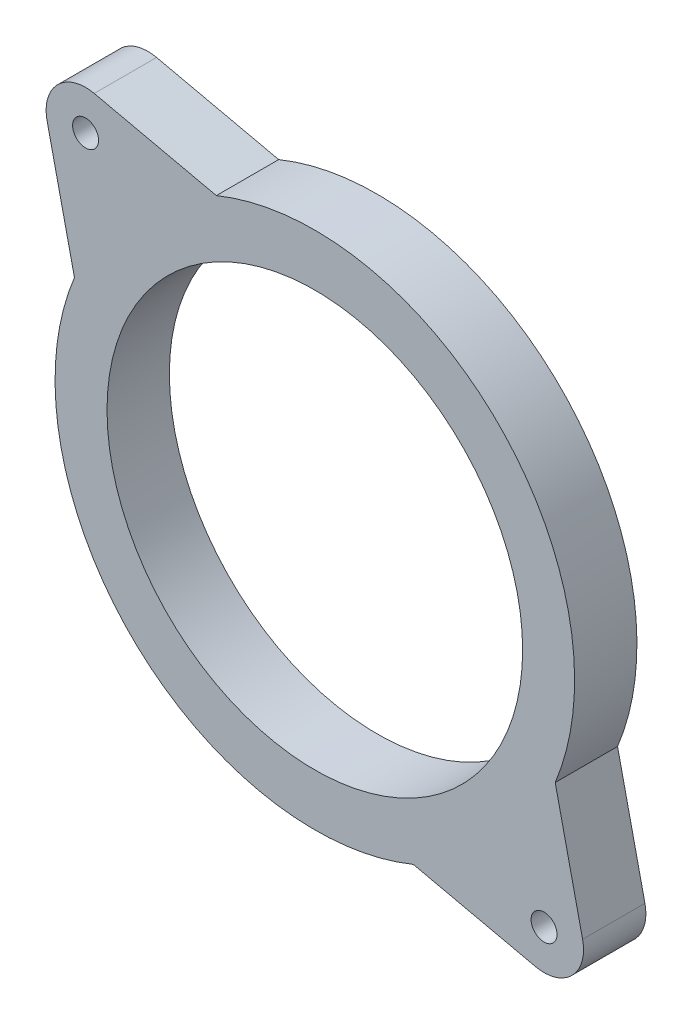
ISO-10303-21;
HEADER;
FILE_DESCRIPTION(('STEP AP214'),'2;1');
FILE_NAME('part.step','',(''),(''),'','','');
FILE_SCHEMA(('AUTOMOTIVE_DESIGN { 1 0 10303 214 1 1 1 1 }'));
ENDSEC;
DATA;
#1=APPLICATION_CONTEXT('core data for automotive mechanical design processes');
#2=APPLICATION_PROTOCOL_DEFINITION('international standard','automotive_design',2000,#1);
#3=PRODUCT_CONTEXT('',#1,'mechanical');
#4=PRODUCT('Part','Part','',(#3));
#5=PRODUCT_RELATED_PRODUCT_CATEGORY('part','',(#4));
#6=PRODUCT_DEFINITION_FORMATION('','',#4);
#7=PRODUCT_DEFINITION_CONTEXT('part definition',#1,'design');
#8=PRODUCT_DEFINITION('design','',#6,#7);
#9=PRODUCT_DEFINITION_SHAPE('','',#8);
#10=(LENGTH_UNIT() NAMED_UNIT(*) SI_UNIT(.MILLI.,.METRE.));
#11=(NAMED_UNIT(*) PLANE_ANGLE_UNIT() SI_UNIT($,.RADIAN.));
#12=(NAMED_UNIT(*) SI_UNIT($,.STERADIAN.) SOLID_ANGLE_UNIT());
#13=UNCERTAINTY_MEASURE_WITH_UNIT(LENGTH_MEASURE(1.E-05),#10,'distance_accuracy_value','');
#14=(GEOMETRIC_REPRESENTATION_CONTEXT(3) GLOBAL_UNCERTAINTY_ASSIGNED_CONTEXT((#13)) GLOBAL_UNIT_ASSIGNED_CONTEXT((#10,
#11,#12)) REPRESENTATION_CONTEXT('',''));
#15=CARTESIAN_POINT('',(0.,0.,0.));
#16=DIRECTION('',(0.,0.,1.));
#17=DIRECTION('',(1.,0.,0.));
#18=AXIS2_PLACEMENT_3D('',#15,#16,#17);
#19=CARTESIAN_POINT('',(0.,0.,6.));
#20=DIRECTION('',(0.,0.,1.));
#21=DIRECTION('',(1.,0.,0.));
#22=AXIS2_PLACEMENT_3D('',#19,#20,#21);
#23=PLANE('',#22);
#24=CARTESIAN_POINT('',(-22.0617315730203,22.0617315730202,6.));
#25=DIRECTION('',(0.,0.,1.));
#26=DIRECTION('',(1.,0.,0.));
#27=AXIS2_PLACEMENT_3D('',#24,#25,#26);
#28=CIRCLE('',#27,1.24999999999999);
#29=CARTESIAN_POINT('',(-20.8117315730203,22.0617315730202,6.));
#30=VERTEX_POINT('',#29);
#31=EDGE_CURVE('E196',#30,#30,#28,.T.);
#32=ORIENTED_EDGE('',*,*,#31,.F.);
#33=EDGE_LOOP('',(#32));
#34=FACE_BOUND('',#33,.T.);
#35=CARTESIAN_POINT('',(22.0617315730203,-22.0617315730202,6.));
#36=DIRECTION('',(0.,0.,1.));
#37=DIRECTION('',(1.,0.,0.));
#38=AXIS2_PLACEMENT_3D('',#35,#36,#37);
#39=CIRCLE('',#38,1.24999999999999);
#40=CARTESIAN_POINT('',(23.3117315730203,-22.0617315730202,6.));
#41=VERTEX_POINT('',#40);
#42=EDGE_CURVE('E190',#41,#41,#39,.T.);
#43=ORIENTED_EDGE('',*,*,#42,.F.);
#44=EDGE_LOOP('',(#43));
#45=FACE_BOUND('',#44,.T.);
#46=CARTESIAN_POINT('',(0.,0.,6.));
#47=DIRECTION('',(0.,0.,1.));
#48=DIRECTION('',(1.,0.,0.));
#49=AXIS2_PLACEMENT_3D('',#46,#47,#48);
#50=CIRCLE('',#49,25.);
#51=CARTESIAN_POINT('',(-23.1341304887046,9.47691967527358,6.));
#52=VERTEX_POINT('',#51);
#53=CARTESIAN_POINT('',(9.47691967527366,-23.1341304887046,6.));
#54=VERTEX_POINT('',#53);
#55=EDGE_CURVE('E148',#52,#54,#50,.T.);
#56=ORIENTED_EDGE('',*,*,#55,.T.);
#57=DIRECTION('',(0.975769204515665,-0.21880232978391,0.));
#58=VECTOR('',#57,1.);
#59=CARTESIAN_POINT('',(9.47691967527366,-23.1341304887046,6.));
#60=LINE('',#59,#58);
#61=CARTESIAN_POINT('',(21.2302827198415,-25.7696545501798,6.));
#62=VERTEX_POINT('',#61);
#63=EDGE_CURVE('E96',#54,#62,#60,.T.);
#64=ORIENTED_EDGE('',*,*,#63,.T.);
#65=CARTESIAN_POINT('',(22.0617315730203,-22.0617315730202,6.));
#66=DIRECTION('',(0.,0.,1.));
#67=DIRECTION('',(1.,0.,0.));
#68=AXIS2_PLACEMENT_3D('',#65,#66,#67);
#69=CIRCLE('',#68,3.80000000000001);
#70=CARTESIAN_POINT('',(25.7696545501799,-21.2302827198414,6.));
#71=VERTEX_POINT('',#70);
#72=EDGE_CURVE('E163',#62,#71,#69,.T.);
#73=ORIENTED_EDGE('',*,*,#72,.T.);
#74=DIRECTION('',(-0.218802329783913,0.975769204515664,0.));
#75=VECTOR('',#74,1.);
#76=CARTESIAN_POINT('',(25.7696545501799,-21.2302827198414,6.));
#77=LINE('',#76,#75);
#78=CARTESIAN_POINT('',(23.1341304887046,-9.47691967527358,6.));
#79=VERTEX_POINT('',#78);
#80=EDGE_CURVE('E176',#71,#79,#77,.T.);
#81=ORIENTED_EDGE('',*,*,#80,.T.);
#82=CARTESIAN_POINT('',(0.,0.,6.));
#83=DIRECTION('',(0.,0.,1.));
#84=DIRECTION('',(1.,0.,0.));
#85=AXIS2_PLACEMENT_3D('',#82,#83,#84);
#86=CIRCLE('',#85,25.);
#87=CARTESIAN_POINT('',(-9.47691967527366,23.1341304887046,6.));
#88=VERTEX_POINT('',#87);
#89=EDGE_CURVE('E115',#79,#88,#86,.T.);
#90=ORIENTED_EDGE('',*,*,#89,.T.);
#91=DIRECTION('',(-0.975769204515665,0.21880232978391,0.));
#92=VECTOR('',#91,1.);
#93=CARTESIAN_POINT('',(-9.47691967527366,23.1341304887046,6.));
#94=LINE('',#93,#92);
#95=CARTESIAN_POINT('',(-21.2302827198415,25.7696545501798,6.));
#96=VERTEX_POINT('',#95);
#97=EDGE_CURVE('E109',#88,#96,#94,.T.);
#98=ORIENTED_EDGE('',*,*,#97,.T.);
#99=CARTESIAN_POINT('',(-22.0617315730203,22.0617315730202,6.));
#100=DIRECTION('',(0.,0.,1.));
#101=DIRECTION('',(1.,0.,0.));
#102=AXIS2_PLACEMENT_3D('',#99,#100,#101);
#103=CIRCLE('',#102,3.80000000000001);
#104=CARTESIAN_POINT('',(-25.7696545501799,21.2302827198414,6.));
#105=VERTEX_POINT('',#104);
#106=EDGE_CURVE('E113',#96,#105,#103,.T.);
#107=ORIENTED_EDGE('',*,*,#106,.T.);
#108=DIRECTION('',(0.218802329783914,-0.975769204515664,0.));
#109=VECTOR('',#108,1.);
#110=CARTESIAN_POINT('',(-25.7696545501799,21.2302827198414,6.));
#111=LINE('',#110,#109);
#112=EDGE_CURVE('E53',#105,#52,#111,.T.);
#113=ORIENTED_EDGE('',*,*,#112,.T.);
#114=EDGE_LOOP('',(#56,#64,#73,#81,#90,#98,#107,#113));
#115=FACE_BOUND('',#114,.T.);
#116=CARTESIAN_POINT('',(0.,0.,6.));
#117=DIRECTION('',(0.,0.,1.));
#118=DIRECTION('',(1.,0.,0.));
#119=AXIS2_PLACEMENT_3D('',#116,#117,#118);
#120=CIRCLE('',#119,20.);
#121=CARTESIAN_POINT('',(20.,0.,6.));
#122=VERTEX_POINT('',#121);
#123=EDGE_CURVE('E137',#122,#122,#120,.T.);
#124=ORIENTED_EDGE('',*,*,#123,.F.);
#125=EDGE_LOOP('',(#124));
#126=FACE_BOUND('',#125,.T.);
#127=ADVANCED_FACE('F36',(#34,#45,#115,#126),#23,.T.);
#128=CARTESIAN_POINT('',(0.,0.,0.));
#129=DIRECTION('',(0.,0.,1.));
#130=DIRECTION('',(1.,0.,0.));
#131=AXIS2_PLACEMENT_3D('',#128,#129,#130);
#132=PLANE('',#131);
#133=CARTESIAN_POINT('',(-22.0617315730203,22.0617315730202,0.));
#134=DIRECTION('',(0.,0.,1.));
#135=DIRECTION('',(1.,0.,0.));
#136=AXIS2_PLACEMENT_3D('',#133,#134,#135);
#137=CIRCLE('',#136,1.25);
#138=CARTESIAN_POINT('',(-20.8117315730203,22.0617315730202,0.));
#139=VERTEX_POINT('',#138);
#140=EDGE_CURVE('E193',#139,#139,#137,.T.);
#141=ORIENTED_EDGE('',*,*,#140,.T.);
#142=EDGE_LOOP('',(#141));
#143=FACE_BOUND('',#142,.T.);
#144=CARTESIAN_POINT('',(22.0617315730203,-22.0617315730202,0.));
#145=DIRECTION('',(0.,0.,1.));
#146=DIRECTION('',(1.,0.,0.));
#147=AXIS2_PLACEMENT_3D('',#144,#145,#146);
#148=CIRCLE('',#147,1.25);
#149=CARTESIAN_POINT('',(23.3117315730203,-22.0617315730202,0.));
#150=VERTEX_POINT('',#149);
#151=EDGE_CURVE('E185',#150,#150,#148,.T.);
#152=ORIENTED_EDGE('',*,*,#151,.T.);
#153=EDGE_LOOP('',(#152));
#154=FACE_BOUND('',#153,.T.);
#155=CARTESIAN_POINT('',(0.,0.,0.));
#156=DIRECTION('',(0.,0.,1.));
#157=DIRECTION('',(1.,0.,0.));
#158=AXIS2_PLACEMENT_3D('',#155,#156,#157);
#159=CIRCLE('',#158,25.);
#160=CARTESIAN_POINT('',(-23.1341304887046,9.47691967527358,0.));
#161=VERTEX_POINT('',#160);
#162=CARTESIAN_POINT('',(9.47691967527366,-23.1341304887046,0.));
#163=VERTEX_POINT('',#162);
#164=EDGE_CURVE('E133',#161,#163,#159,.T.);
#165=ORIENTED_EDGE('',*,*,#164,.F.);
#166=DIRECTION('',(0.218802329783914,-0.975769204515664,0.));
#167=VECTOR('',#166,1.);
#168=CARTESIAN_POINT('',(-25.7696545501799,21.2302827198414,0.));
#169=LINE('',#168,#167);
#170=CARTESIAN_POINT('',(-25.7696545501799,21.2302827198414,0.));
#171=VERTEX_POINT('',#170);
#172=EDGE_CURVE('E88',#171,#161,#169,.T.);
#173=ORIENTED_EDGE('',*,*,#172,.F.);
#174=CARTESIAN_POINT('',(-22.0617315730203,22.0617315730202,0.));
#175=DIRECTION('',(0.,0.,1.));
#176=DIRECTION('',(1.,0.,0.));
#177=AXIS2_PLACEMENT_3D('',#174,#175,#176);
#178=CIRCLE('',#177,3.80000000000001);
#179=CARTESIAN_POINT('',(-21.2302827198415,25.7696545501798,0.));
#180=VERTEX_POINT('',#179);
#181=EDGE_CURVE('E82',#180,#171,#178,.T.);
#182=ORIENTED_EDGE('',*,*,#181,.F.);
#183=DIRECTION('',(-0.975769204515665,0.21880232978391,0.));
#184=VECTOR('',#183,1.);
#185=CARTESIAN_POINT('',(-9.47691967527366,23.1341304887046,0.));
#186=LINE('',#185,#184);
#187=CARTESIAN_POINT('',(-9.47691967527366,23.1341304887046,0.));
#188=VERTEX_POINT('',#187);
#189=EDGE_CURVE('E123',#188,#180,#186,.T.);
#190=ORIENTED_EDGE('',*,*,#189,.F.);
#191=CARTESIAN_POINT('',(0.,0.,0.));
#192=DIRECTION('',(0.,0.,1.));
#193=DIRECTION('',(1.,0.,0.));
#194=AXIS2_PLACEMENT_3D('',#191,#192,#193);
#195=CIRCLE('',#194,25.);
#196=CARTESIAN_POINT('',(23.1341304887046,-9.47691967527358,0.));
#197=VERTEX_POINT('',#196);
#198=EDGE_CURVE('E143',#197,#188,#195,.T.);
#199=ORIENTED_EDGE('',*,*,#198,.F.);
#200=DIRECTION('',(-0.218802329783913,0.975769204515664,0.));
#201=VECTOR('',#200,1.);
#202=CARTESIAN_POINT('',(25.7696545501799,-21.2302827198414,0.));
#203=LINE('',#202,#201);
#204=CARTESIAN_POINT('',(25.7696545501799,-21.2302827198414,0.));
#205=VERTEX_POINT('',#204);
#206=EDGE_CURVE('E141',#205,#197,#203,.T.);
#207=ORIENTED_EDGE('',*,*,#206,.F.);
#208=CARTESIAN_POINT('',(22.0617315730203,-22.0617315730202,0.));
#209=DIRECTION('',(0.,0.,1.));
#210=DIRECTION('',(1.,0.,0.));
#211=AXIS2_PLACEMENT_3D('',#208,#209,#210);
#212=CIRCLE('',#211,3.80000000000001);
#213=CARTESIAN_POINT('',(21.2302827198415,-25.7696545501798,0.));
#214=VERTEX_POINT('',#213);
#215=EDGE_CURVE('E139',#214,#205,#212,.T.);
#216=ORIENTED_EDGE('',*,*,#215,.F.);
#217=DIRECTION('',(0.975769204515665,-0.21880232978391,0.));
#218=VECTOR('',#217,1.);
#219=CARTESIAN_POINT('',(9.47691967527366,-23.1341304887046,0.));
#220=LINE('',#219,#218);
#221=EDGE_CURVE('E136',#163,#214,#220,.T.);
#222=ORIENTED_EDGE('',*,*,#221,.F.);
#223=EDGE_LOOP('',(#165,#173,#182,#190,#199,#207,#216,#222));
#224=FACE_BOUND('',#223,.T.);
#225=CARTESIAN_POINT('',(0.,0.,0.));
#226=DIRECTION('',(0.,0.,1.));
#227=DIRECTION('',(1.,0.,0.));
#228=AXIS2_PLACEMENT_3D('',#225,#226,#227);
#229=CIRCLE('',#228,20.);
#230=CARTESIAN_POINT('',(20.,0.,0.));
#231=VERTEX_POINT('',#230);
#232=EDGE_CURVE('E182',#231,#231,#229,.T.);
#233=ORIENTED_EDGE('',*,*,#232,.T.);
#234=EDGE_LOOP('',(#233));
#235=FACE_BOUND('',#234,.T.);
#236=ADVANCED_FACE('F167',(#143,#154,#224,#235),#132,.F.);
#237=CARTESIAN_POINT('',(0.,0.,6.));
#238=DIRECTION('',(0.,0.,-1.));
#239=DIRECTION('',(-1.,0.,0.));
#240=AXIS2_PLACEMENT_3D('',#237,#238,#239);
#241=CYLINDRICAL_SURFACE('',#240,25.);
#242=ORIENTED_EDGE('',*,*,#164,.T.);
#243=DIRECTION('',(0.,0.,-1.));
#244=VECTOR('',#243,1.);
#245=CARTESIAN_POINT('',(9.47691967527366,-23.1341304887046,6.));
#246=LINE('',#245,#244);
#247=EDGE_CURVE('E11',#54,#163,#246,.T.);
#248=ORIENTED_EDGE('',*,*,#247,.F.);
#249=ORIENTED_EDGE('',*,*,#55,.F.);
#250=DIRECTION('',(0.,0.,-1.));
#251=VECTOR('',#250,1.);
#252=CARTESIAN_POINT('',(-23.1341304887046,9.47691967527358,6.));
#253=LINE('',#252,#251);
#254=EDGE_CURVE('E129',#52,#161,#253,.T.);
#255=ORIENTED_EDGE('',*,*,#254,.T.);
#256=EDGE_LOOP('',(#242,#248,#249,#255));
#257=FACE_BOUND('',#256,.T.);
#258=ADVANCED_FACE('F38',(#257),#241,.T.);
#259=CARTESIAN_POINT('',(9.47691967527366,-23.1341304887046,6.));
#260=DIRECTION('',(0.21880232978391,0.975769204515665,0.));
#261=DIRECTION('',(-0.975769204515665,0.21880232978391,0.));
#262=AXIS2_PLACEMENT_3D('',#259,#260,#261);
#263=PLANE('',#262);
#264=ORIENTED_EDGE('',*,*,#221,.T.);
#265=DIRECTION('',(0.,0.,-1.));
#266=VECTOR('',#265,1.);
#267=CARTESIAN_POINT('',(21.2302827198415,-25.7696545501798,6.));
#268=LINE('',#267,#266);
#269=EDGE_CURVE('E45',#62,#214,#268,.T.);
#270=ORIENTED_EDGE('',*,*,#269,.F.);
#271=ORIENTED_EDGE('',*,*,#63,.F.);
#272=ORIENTED_EDGE('',*,*,#247,.T.);
#273=EDGE_LOOP('',(#264,#270,#271,#272));
#274=FACE_BOUND('',#273,.T.);
#275=ADVANCED_FACE('F237',(#274),#263,.F.);
#276=CARTESIAN_POINT('',(22.0617315730203,-22.0617315730202,6.));
#277=DIRECTION('',(0.,0.,-1.));
#278=DIRECTION('',(-1.,0.,0.));
#279=AXIS2_PLACEMENT_3D('',#276,#277,#278);
#280=CYLINDRICAL_SURFACE('',#279,3.80000000000001);
#281=ORIENTED_EDGE('',*,*,#215,.T.);
#282=DIRECTION('',(0.,0.,-1.));
#283=VECTOR('',#282,1.);
#284=CARTESIAN_POINT('',(25.7696545501799,-21.2302827198414,6.));
#285=LINE('',#284,#283);
#286=EDGE_CURVE('E155',#71,#205,#285,.T.);
#287=ORIENTED_EDGE('',*,*,#286,.F.);
#288=ORIENTED_EDGE('',*,*,#72,.F.);
#289=ORIENTED_EDGE('',*,*,#269,.T.);
#290=EDGE_LOOP('',(#281,#287,#288,#289));
#291=FACE_BOUND('',#290,.T.);
#292=ADVANCED_FACE('F161',(#291),#280,.T.);
#293=CARTESIAN_POINT('',(25.7696545501799,-21.2302827198414,6.));
#294=DIRECTION('',(-0.975769204515664,-0.218802329783913,0.));
#295=DIRECTION('',(0.218802329783913,-0.975769204515664,0.));
#296=AXIS2_PLACEMENT_3D('',#293,#294,#295);
#297=PLANE('',#296);
#298=ORIENTED_EDGE('',*,*,#206,.T.);
#299=DIRECTION('',(0.,0.,-1.));
#300=VECTOR('',#299,1.);
#301=CARTESIAN_POINT('',(23.1341304887046,-9.47691967527358,6.));
#302=LINE('',#301,#300);
#303=EDGE_CURVE('E152',#79,#197,#302,.T.);
#304=ORIENTED_EDGE('',*,*,#303,.F.);
#305=ORIENTED_EDGE('',*,*,#80,.F.);
#306=ORIENTED_EDGE('',*,*,#286,.T.);
#307=EDGE_LOOP('',(#298,#304,#305,#306));
#308=FACE_BOUND('',#307,.T.);
#309=ADVANCED_FACE('F172',(#308),#297,.F.);
#310=CARTESIAN_POINT('',(0.,0.,6.));
#311=DIRECTION('',(0.,0.,-1.));
#312=DIRECTION('',(-1.,0.,0.));
#313=AXIS2_PLACEMENT_3D('',#310,#311,#312);
#314=CYLINDRICAL_SURFACE('',#313,25.);
#315=ORIENTED_EDGE('',*,*,#198,.T.);
#316=DIRECTION('',(0.,0.,-1.));
#317=VECTOR('',#316,1.);
#318=CARTESIAN_POINT('',(-9.47691967527366,23.1341304887046,6.));
#319=LINE('',#318,#317);
#320=EDGE_CURVE('E124',#88,#188,#319,.T.);
#321=ORIENTED_EDGE('',*,*,#320,.F.);
#322=ORIENTED_EDGE('',*,*,#89,.F.);
#323=ORIENTED_EDGE('',*,*,#303,.T.);
#324=EDGE_LOOP('',(#315,#321,#322,#323));
#325=FACE_BOUND('',#324,.T.);
#326=ADVANCED_FACE('F175',(#325),#314,.T.);
#327=CARTESIAN_POINT('',(-9.47691967527366,23.1341304887046,6.));
#328=DIRECTION('',(-0.21880232978391,-0.975769204515665,0.));
#329=DIRECTION('',(0.975769204515665,-0.21880232978391,0.));
#330=AXIS2_PLACEMENT_3D('',#327,#328,#329);
#331=PLANE('',#330);
#332=ORIENTED_EDGE('',*,*,#189,.T.);
#333=DIRECTION('',(0.,0.,-1.));
#334=VECTOR('',#333,1.);
#335=CARTESIAN_POINT('',(-21.2302827198415,25.7696545501798,6.));
#336=LINE('',#335,#334);
#337=EDGE_CURVE('E120',#96,#180,#336,.T.);
#338=ORIENTED_EDGE('',*,*,#337,.F.);
#339=ORIENTED_EDGE('',*,*,#97,.F.);
#340=ORIENTED_EDGE('',*,*,#320,.T.);
#341=EDGE_LOOP('',(#332,#338,#339,#340));
#342=FACE_BOUND('',#341,.T.);
#343=ADVANCED_FACE('F121',(#342),#331,.F.);
#344=CARTESIAN_POINT('',(-22.0617315730203,22.0617315730202,6.));
#345=DIRECTION('',(0.,0.,-1.));
#346=DIRECTION('',(-1.,0.,0.));
#347=AXIS2_PLACEMENT_3D('',#344,#345,#346);
#348=CYLINDRICAL_SURFACE('',#347,3.80000000000001);
#349=ORIENTED_EDGE('',*,*,#181,.T.);
#350=DIRECTION('',(0.,0.,-1.));
#351=VECTOR('',#350,1.);
#352=CARTESIAN_POINT('',(-25.7696545501799,21.2302827198414,6.));
#353=LINE('',#352,#351);
#354=EDGE_CURVE('E125',#105,#171,#353,.T.);
#355=ORIENTED_EDGE('',*,*,#354,.F.);
#356=ORIENTED_EDGE('',*,*,#106,.F.);
#357=ORIENTED_EDGE('',*,*,#337,.T.);
#358=EDGE_LOOP('',(#349,#355,#356,#357));
#359=FACE_BOUND('',#358,.T.);
#360=ADVANCED_FACE('F127',(#359),#348,.T.);
#361=CARTESIAN_POINT('',(-25.7696545501799,21.2302827198414,6.));
#362=DIRECTION('',(0.975769204515664,0.218802329783914,0.));
#363=DIRECTION('',(-0.218802329783914,0.975769204515664,0.));
#364=AXIS2_PLACEMENT_3D('',#361,#362,#363);
#365=PLANE('',#364);
#366=ORIENTED_EDGE('',*,*,#172,.T.);
#367=ORIENTED_EDGE('',*,*,#254,.F.);
#368=ORIENTED_EDGE('',*,*,#112,.F.);
#369=ORIENTED_EDGE('',*,*,#354,.T.);
#370=EDGE_LOOP('',(#366,#367,#368,#369));
#371=FACE_BOUND('',#370,.T.);
#372=ADVANCED_FACE('F218',(#371),#365,.F.);
#373=CARTESIAN_POINT('',(0.,0.,6.));
#374=DIRECTION('',(0.,0.,-1.));
#375=DIRECTION('',(-1.,0.,0.));
#376=AXIS2_PLACEMENT_3D('',#373,#374,#375);
#377=CYLINDRICAL_SURFACE('',#376,20.);
#378=ORIENTED_EDGE('',*,*,#123,.T.);
#379=EDGE_LOOP('',(#378));
#380=FACE_BOUND('',#379,.T.);
#381=ORIENTED_EDGE('',*,*,#232,.F.);
#382=EDGE_LOOP('',(#381));
#383=FACE_BOUND('',#382,.T.);
#384=ADVANCED_FACE('F209',(#380,#383),#377,.F.);
#385=CARTESIAN_POINT('',(22.0617315730203,-22.0617315730202,6.));
#386=DIRECTION('',(0.,0.,1.));
#387=DIRECTION('',(1.,0.,0.));
#388=AXIS2_PLACEMENT_3D('',#385,#386,#387);
#389=CYLINDRICAL_SURFACE('',#388,1.24999999999999);
#390=ORIENTED_EDGE('',*,*,#151,.F.);
#391=EDGE_LOOP('',(#390));
#392=FACE_BOUND('',#391,.T.);
#393=ORIENTED_EDGE('',*,*,#42,.T.);
#394=EDGE_LOOP('',(#393));
#395=FACE_BOUND('',#394,.T.);
#396=ADVANCED_FACE('F207',(#392,#395),#389,.F.);
#397=CARTESIAN_POINT('',(-22.0617315730203,22.0617315730202,6.));
#398=DIRECTION('',(0.,0.,1.));
#399=DIRECTION('',(1.,0.,0.));
#400=AXIS2_PLACEMENT_3D('',#397,#398,#399);
#401=CYLINDRICAL_SURFACE('',#400,1.24999999999999);
#402=ORIENTED_EDGE('',*,*,#140,.F.);
#403=EDGE_LOOP('',(#402));
#404=FACE_BOUND('',#403,.T.);
#405=ORIENTED_EDGE('',*,*,#31,.T.);
#406=EDGE_LOOP('',(#405));
#407=FACE_BOUND('',#406,.T.);
#408=ADVANCED_FACE('F200',(#404,#407),#401,.F.);
#409=CLOSED_SHELL('',(#127,#236,#258,#275,#292,#309,#326,#343,#360,#372,#384,#396,#408));
#410=MANIFOLD_SOLID_BREP('B2',#409);
#411=ADVANCED_BREP_SHAPE_REPRESENTATION('',(#18,#410),#14);
#412=SHAPE_DEFINITION_REPRESENTATION(#9,#411);
ENDSEC;
END-ISO-10303-21;
